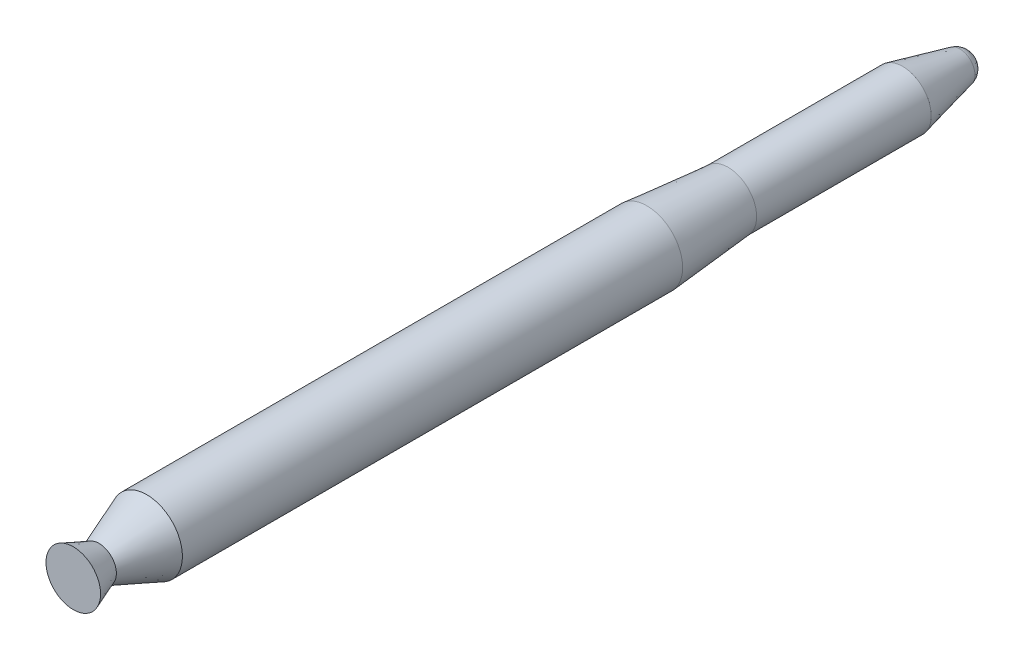
ISO-10303-21;
HEADER;
FILE_DESCRIPTION(('STEP AP214'),'2;1');
FILE_NAME('part.step','',(''),(''),'','','');
FILE_SCHEMA(('AUTOMOTIVE_DESIGN { 1 0 10303 214 1 1 1 1 }'));
ENDSEC;
DATA;
#1=APPLICATION_CONTEXT('core data for automotive mechanical design processes');
#2=APPLICATION_PROTOCOL_DEFINITION('international standard','automotive_design',2000,#1);
#3=PRODUCT_CONTEXT('',#1,'mechanical');
#4=PRODUCT('Part','Part','',(#3));
#5=PRODUCT_RELATED_PRODUCT_CATEGORY('part','',(#4));
#6=PRODUCT_DEFINITION_FORMATION('','',#4);
#7=PRODUCT_DEFINITION_CONTEXT('part definition',#1,'design');
#8=PRODUCT_DEFINITION('design','',#6,#7);
#9=PRODUCT_DEFINITION_SHAPE('','',#8);
#10=(LENGTH_UNIT() NAMED_UNIT(*) SI_UNIT(.MILLI.,.METRE.));
#11=(NAMED_UNIT(*) PLANE_ANGLE_UNIT() SI_UNIT($,.RADIAN.));
#12=(NAMED_UNIT(*) SI_UNIT($,.STERADIAN.) SOLID_ANGLE_UNIT());
#13=UNCERTAINTY_MEASURE_WITH_UNIT(LENGTH_MEASURE(1.E-05),#10,'distance_accuracy_value','');
#14=(GEOMETRIC_REPRESENTATION_CONTEXT(3) GLOBAL_UNCERTAINTY_ASSIGNED_CONTEXT((#13)) GLOBAL_UNIT_ASSIGNED_CONTEXT((#10,
#11,#12)) REPRESENTATION_CONTEXT('',''));
#15=CARTESIAN_POINT('',(0.,0.,0.));
#16=DIRECTION('',(0.,0.,1.));
#17=DIRECTION('',(1.,0.,0.));
#18=AXIS2_PLACEMENT_3D('',#15,#16,#17);
#19=CARTESIAN_POINT('',(0.,0.,3336.58712126024));
#20=DIRECTION('',(0.,0.,-1.));
#21=DIRECTION('',(-1.,0.,0.));
#22=AXIS2_PLACEMENT_3D('',#19,#20,#21);
#23=CONICAL_SURFACE('',#22,1215.,0.367616888275835);
#24=CARTESIAN_POINT('',(0.,0.,-6.12323399573677E-13));
#25=DIRECTION('',(0.,0.,1.));
#26=DIRECTION('',(1.,0.,0.));
#27=AXIS2_PLACEMENT_3D('',#24,#25,#26);
#28=CIRCLE('',#27,2500.);
#29=CARTESIAN_POINT('',(2500.,0.,-6.12323399573677E-13));
#30=VERTEX_POINT('',#29);
#31=EDGE_CURVE('E56',#30,#30,#28,.T.);
#32=ORIENTED_EDGE('',*,*,#31,.T.);
#33=EDGE_LOOP('',(#32));
#34=FACE_BOUND('',#33,.T.);
#35=CARTESIAN_POINT('',(0.,0.,3336.58712126024));
#36=DIRECTION('',(0.,0.,1.));
#37=DIRECTION('',(1.,0.,0.));
#38=AXIS2_PLACEMENT_3D('',#35,#36,#37);
#39=CIRCLE('',#38,1215.);
#40=CARTESIAN_POINT('',(1215.,0.,3336.58712126024));
#41=VERTEX_POINT('',#40);
#42=EDGE_CURVE('E11',#41,#41,#39,.T.);
#43=ORIENTED_EDGE('',*,*,#42,.F.);
#44=EDGE_LOOP('',(#43));
#45=FACE_BOUND('',#44,.T.);
#46=ADVANCED_FACE('F49',(#34,#45),#23,.T.);
#47=CARTESIAN_POINT('',(0.,0.,0.));
#48=DIRECTION('',(0.,0.,1.));
#49=DIRECTION('',(1.,0.,0.));
#50=AXIS2_PLACEMENT_3D('',#47,#48,#49);
#51=CYLINDRICAL_SURFACE('',#50,2500.);
#52=CARTESIAN_POINT('',(0.,0.,-35000.));
#53=DIRECTION('',(0.,0.,1.));
#54=DIRECTION('',(1.,0.,0.));
#55=AXIS2_PLACEMENT_3D('',#52,#53,#54);
#56=CIRCLE('',#55,2500.);
#57=CARTESIAN_POINT('',(2500.,0.,-35000.));
#58=VERTEX_POINT('',#57);
#59=EDGE_CURVE('E84',#58,#58,#56,.T.);
#60=ORIENTED_EDGE('',*,*,#59,.T.);
#61=EDGE_LOOP('',(#60));
#62=FACE_BOUND('',#61,.T.);
#63=ORIENTED_EDGE('',*,*,#31,.F.);
#64=EDGE_LOOP('',(#63));
#65=FACE_BOUND('',#64,.T.);
#66=ADVANCED_FACE('F93',(#62,#65),#51,.T.);
#67=CARTESIAN_POINT('',(0.,0.,-35000.));
#68=DIRECTION('',(0.,0.,1.));
#69=DIRECTION('',(1.,0.,0.));
#70=AXIS2_PLACEMENT_3D('',#67,#68,#69);
#71=CONICAL_SURFACE('',#70,2500.,0.0878321848183038);
#72=CARTESIAN_POINT('',(0.,0.,-40678.0278266314));
#73=DIRECTION('',(0.,0.,1.));
#74=DIRECTION('',(1.,0.,0.));
#75=AXIS2_PLACEMENT_3D('',#72,#73,#74);
#76=CIRCLE('',#75,2000.);
#77=CARTESIAN_POINT('',(2000.,0.,-40678.0278266314));
#78=VERTEX_POINT('',#77);
#79=EDGE_CURVE('E76',#78,#78,#76,.T.);
#80=ORIENTED_EDGE('',*,*,#79,.T.);
#81=EDGE_LOOP('',(#80));
#82=FACE_BOUND('',#81,.T.);
#83=ORIENTED_EDGE('',*,*,#59,.F.);
#84=EDGE_LOOP('',(#83));
#85=FACE_BOUND('',#84,.T.);
#86=ADVANCED_FACE('F95',(#82,#85),#71,.T.);
#87=CARTESIAN_POINT('',(0.,0.,0.));
#88=DIRECTION('',(0.,0.,1.));
#89=DIRECTION('',(1.,0.,0.));
#90=AXIS2_PLACEMENT_3D('',#87,#88,#89);
#91=CYLINDRICAL_SURFACE('',#90,2000.);
#92=CARTESIAN_POINT('',(0.,0.,-52893.4128787398));
#93=DIRECTION('',(0.,0.,1.));
#94=DIRECTION('',(1.,0.,0.));
#95=AXIS2_PLACEMENT_3D('',#92,#93,#94);
#96=CIRCLE('',#95,2000.);
#97=CARTESIAN_POINT('',(2000.,0.,-52893.4128787398));
#98=VERTEX_POINT('',#97);
#99=EDGE_CURVE('E70',#98,#98,#96,.T.);
#100=ORIENTED_EDGE('',*,*,#99,.T.);
#101=EDGE_LOOP('',(#100));
#102=FACE_BOUND('',#101,.T.);
#103=ORIENTED_EDGE('',*,*,#79,.F.);
#104=EDGE_LOOP('',(#103));
#105=FACE_BOUND('',#104,.T.);
#106=ADVANCED_FACE('F100',(#102,#105),#91,.T.);
#107=CARTESIAN_POINT('',(0.,0.,-52893.4128787398));
#108=DIRECTION('',(0.,0.,1.));
#109=DIRECTION('',(1.,0.,0.));
#110=AXIS2_PLACEMENT_3D('',#107,#108,#109);
#111=CONICAL_SURFACE('',#110,2000.,0.23058819821272);
#112=CARTESIAN_POINT('',(0.,0.,-56895.7430030165));
#113=DIRECTION('',(0.,0.,1.));
#114=DIRECTION('',(1.,0.,0.));
#115=AXIS2_PLACEMENT_3D('',#112,#113,#114);
#116=CIRCLE('',#115,1060.39739913512);
#117=CARTESIAN_POINT('',(1060.39739913512,0.,-56895.7430030165));
#118=VERTEX_POINT('',#117);
#119=EDGE_CURVE('E67',#118,#118,#116,.T.);
#120=ORIENTED_EDGE('',*,*,#119,.T.);
#121=EDGE_LOOP('',(#120));
#122=FACE_BOUND('',#121,.T.);
#123=ORIENTED_EDGE('',*,*,#99,.F.);
#124=EDGE_LOOP('',(#123));
#125=FACE_BOUND('',#124,.T.);
#126=ADVANCED_FACE('F63',(#122,#125),#111,.T.);
#127=CARTESIAN_POINT('',(86.8652685270441,0.,-56667.1928101185));
#128=DIRECTION('',(0.,-1.,0.));
#129=DIRECTION('',(1.,0.,0.));
#130=AXIS2_PLACEMENT_3D('',#127,#128,#129);
#131=CIRCLE('',#130,1000.);
#132=TRIMMED_CURVE('',#131,(PARAMETER_VALUE(-1.65777120932463)),
(PARAMETER_VALUE(1.65777120932463)),.T.,.PARAMETER.);
#133=CARTESIAN_POINT('',(0.,0.,-56667.1928101185));
#134=DIRECTION('',(0.,0.,1.));
#135=AXIS1_PLACEMENT('',#133,#134);
#136=SURFACE_OF_REVOLUTION('',#132,#135);
#137=CARTESIAN_POINT('',(0.,0.,-57663.4128787398));
#138=VERTEX_POINT('',#137);
#139=VERTEX_LOOP('',#138);
#140=FACE_BOUND('',#139,.T.);
#141=ORIENTED_EDGE('',*,*,#119,.F.);
#142=EDGE_LOOP('',(#141));
#143=FACE_BOUND('',#142,.T.);
#144=ADVANCED_FACE('F59',(#140,#143),#136,.T.);
#145=CARTESIAN_POINT('',(0.,0.,3336.58712126024));
#146=DIRECTION('',(0.,0.,1.));
#147=DIRECTION('',(1.,0.,0.));
#148=AXIS2_PLACEMENT_3D('',#145,#146,#147);
#149=CONICAL_SURFACE('',#148,1215.,0.368039574601233);
#150=CARTESIAN_POINT('',(0.,0.,5136.58712126024));
#151=DIRECTION('',(0.,0.,-1.));
#152=DIRECTION('',(-1.,0.,0.));
#153=AXIS2_PLACEMENT_3D('',#150,#151,#152);
#154=CIRCLE('',#153,1909.09714470478);
#155=CARTESIAN_POINT('',(-1909.09714470478,0.,5136.58712126024));
#156=VERTEX_POINT('',#155);
#157=EDGE_CURVE('E71',#156,#156,#154,.T.);
#158=ORIENTED_EDGE('',*,*,#157,.T.);
#159=EDGE_LOOP('',(#158));
#160=FACE_BOUND('',#159,.T.);
#161=ORIENTED_EDGE('',*,*,#42,.T.);
#162=EDGE_LOOP('',(#161));
#163=FACE_BOUND('',#162,.T.);
#164=ADVANCED_FACE('F62',(#160,#163),#149,.T.);
#165=CARTESIAN_POINT('',(1909.09714470478,0.,5136.58712126024));
#166=DIRECTION('',(0.,0.,1.));
#167=DIRECTION('',(1.,0.,0.));
#168=AXIS2_PLACEMENT_3D('',#165,#166,#167);
#169=PLANE('',#168);
#170=ORIENTED_EDGE('',*,*,#157,.F.);
#171=EDGE_LOOP('',(#170));
#172=FACE_BOUND('',#171,.T.);
#173=ADVANCED_FACE('F112',(#172),#169,.T.);
#174=CLOSED_SHELL('',(#46,#66,#86,#106,#126,#144,#164,#173));
#175=MANIFOLD_SOLID_BREP('B2',#174);
#176=ADVANCED_BREP_SHAPE_REPRESENTATION('',(#18,#175),#14);
#177=SHAPE_DEFINITION_REPRESENTATION(#9,#176);
ENDSEC;
END-ISO-10303-21;
